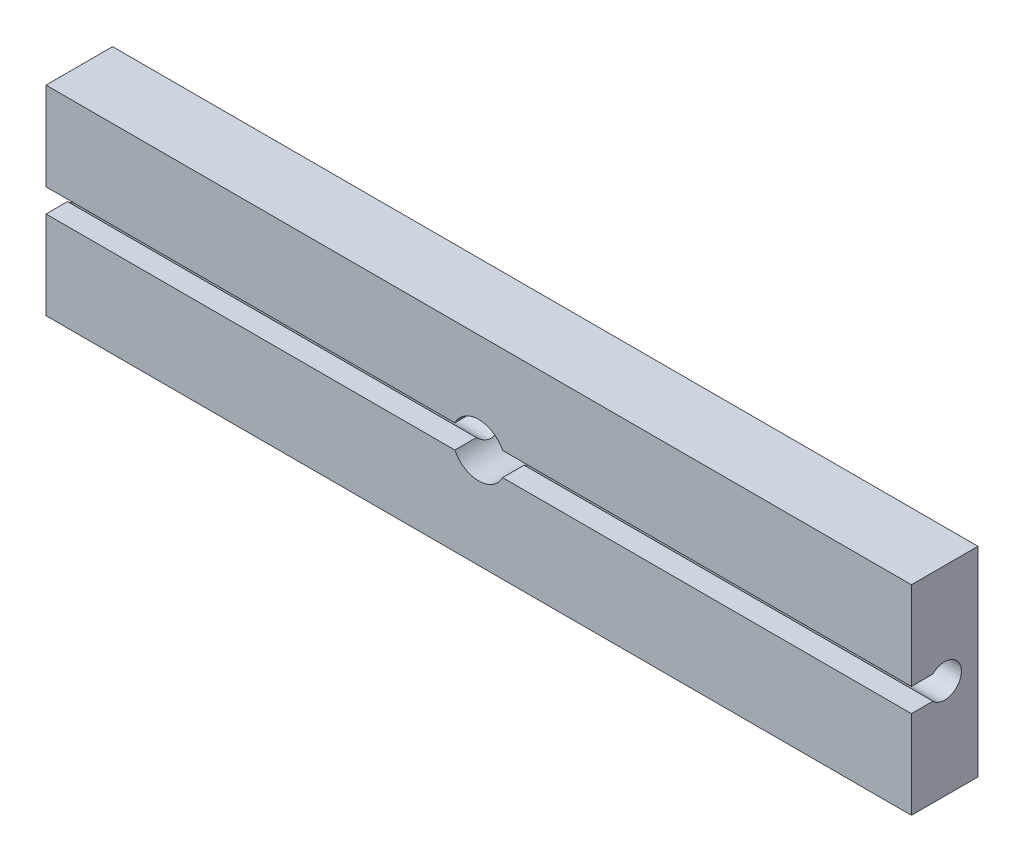
ISO-10303-21;
HEADER;
FILE_DESCRIPTION(('STEP AP214'),'2;1');
FILE_NAME('part.step','',(''),(''),'','','');
FILE_SCHEMA(('AUTOMOTIVE_DESIGN { 1 0 10303 214 1 1 1 1 }'));
ENDSEC;
DATA;
#1=APPLICATION_CONTEXT('core data for automotive mechanical design processes');
#2=APPLICATION_PROTOCOL_DEFINITION('international standard','automotive_design',2000,#1);
#3=PRODUCT_CONTEXT('',#1,'mechanical');
#4=PRODUCT('Part','Part','',(#3));
#5=PRODUCT_RELATED_PRODUCT_CATEGORY('part','',(#4));
#6=PRODUCT_DEFINITION_FORMATION('','',#4);
#7=PRODUCT_DEFINITION_CONTEXT('part definition',#1,'design');
#8=PRODUCT_DEFINITION('design','',#6,#7);
#9=PRODUCT_DEFINITION_SHAPE('','',#8);
#10=(LENGTH_UNIT() NAMED_UNIT(*) SI_UNIT(.MILLI.,.METRE.));
#11=(NAMED_UNIT(*) PLANE_ANGLE_UNIT() SI_UNIT($,.RADIAN.));
#12=(NAMED_UNIT(*) SI_UNIT($,.STERADIAN.) SOLID_ANGLE_UNIT());
#13=UNCERTAINTY_MEASURE_WITH_UNIT(LENGTH_MEASURE(1.E-05),#10,'distance_accuracy_value','');
#14=(GEOMETRIC_REPRESENTATION_CONTEXT(3) GLOBAL_UNCERTAINTY_ASSIGNED_CONTEXT((#13)) GLOBAL_UNIT_ASSIGNED_CONTEXT((#10,
#11,#12)) REPRESENTATION_CONTEXT('',''));
#15=CARTESIAN_POINT('',(0.,0.,0.));
#16=DIRECTION('',(0.,0.,1.));
#17=DIRECTION('',(1.,0.,0.));
#18=AXIS2_PLACEMENT_3D('',#15,#16,#17);
#19=CARTESIAN_POINT('',(65.,0.,4.99999999999773));
#20=DIRECTION('',(-1.,0.,0.));
#21=DIRECTION('',(0.,0.,1.));
#22=AXIS2_PLACEMENT_3D('',#19,#20,#21);
#23=CYLINDRICAL_SURFACE('',#22,2.5);
#24=DIRECTION('',(-1.,0.,0.));
#25=VECTOR('',#24,1.);
#26=CARTESIAN_POINT('',(65.,1.76776695296637,6.76776695296409));
#27=LINE('',#26,#25);
#28=CARTESIAN_POINT('',(65.,1.76776695296637,6.76776695296409));
#29=VERTEX_POINT('',#28);
#30=CARTESIAN_POINT('',(3.58817502360183,1.76776695296637,6.76776695296409));
#31=VERTEX_POINT('',#30);
#32=EDGE_CURVE('E65',#29,#31,#27,.T.);
#33=ORIENTED_EDGE('',*,*,#32,.T.);
#34=CARTESIAN_POINT('',(4.,0.,7.49999999999773));
#35=CARTESIAN_POINT('',(3.99999041333571,0.127017476559871,7.49998952385412));
#36=CARTESIAN_POINT('',(3.9938860659399,0.254191951791703,7.49025350009605));
#37=CARTESIAN_POINT('',(3.97004375552586,0.504637456621344,7.45182887031345));
#38=CARTESIAN_POINT('',(3.95228361873137,0.627900575825985,7.42310413973652));
#39=CARTESIAN_POINT('',(3.90691695293563,0.866410868269162,7.34837714671019));
#40=CARTESIAN_POINT('',(3.87935918690877,0.98169442070943,7.30246039021016));
#41=CARTESIAN_POINT('',(3.81669199838277,1.20252080434994,7.19522833250625));
#42=CARTESIAN_POINT('',(3.7815834126609,1.30806471304098,7.1339147374446));
#43=CARTESIAN_POINT('',(3.70340304945466,1.51594836437078,6.99222684340663));
#44=CARTESIAN_POINT('',(3.65991924217889,1.61735911616791,6.91072139729597));
#45=CARTESIAN_POINT('',(3.57062700058922,1.80597275567284,6.73356165373921));
#46=CARTESIAN_POINT('',(3.52481549782957,1.89315621594405,6.6378883442588));
#47=CARTESIAN_POINT('',(3.42860837235627,2.06285746302521,6.41993221070652));
#48=CARTESIAN_POINT('',(3.37843221966147,2.14314412018317,6.29580042656678));
#49=CARTESIAN_POINT('',(3.28660396278105,2.28147932079995,6.03287036931938));
#50=CARTESIAN_POINT('',(3.2449375200046,2.33956541787438,5.89409737482975));
#51=CARTESIAN_POINT('',(3.18619151248815,2.41866801180576,5.64237895245201));
#52=CARTESIAN_POINT('',(3.16553811970886,2.44539104794679,5.53206636307941));
#53=CARTESIAN_POINT('',(3.1356271466086,2.4836368711914,5.30738814861704));
#54=CARTESIAN_POINT('',(3.12635347378456,2.49518112485638,5.19302848282452));
#55=CARTESIAN_POINT('',(3.12059771534501,2.50237836690497,4.96317396712136));
#56=CARTESIAN_POINT('',(3.12414917427958,2.49798968200884,4.84767692941977));
#57=CARTESIAN_POINT('',(3.14354804883411,2.47352633347829,4.61937979127109));
#58=CARTESIAN_POINT('',(3.15940531965489,2.45343909745149,4.5065819271478));
#59=CARTESIAN_POINT('',(3.20065145822146,2.3993620946426,4.28912310325414));
#60=CARTESIAN_POINT('',(3.22581428653571,2.36570043522604,4.18433512028036));
#61=CARTESIAN_POINT('',(3.28291134443418,2.28580369589507,3.98167760352452));
#62=CARTESIAN_POINT('',(3.31484796808522,2.2395641689404,3.88381053215427));
#63=CARTESIAN_POINT('',(3.38909625095658,2.12589830407261,3.67833359248757));
#64=CARTESIAN_POINT('',(3.4322315520855,2.05612773657747,3.57231894814535));
#65=CARTESIAN_POINT('',(3.52011451554715,1.90176111958637,3.37233887302133));
#66=CARTESIAN_POINT('',(3.56486379714022,1.81714983251341,3.27838599995259));
#67=CARTESIAN_POINT('',(3.65959667460596,1.61904732877734,3.08939899041512));
#68=CARTESIAN_POINT('',(3.70922571443728,1.50309447420017,2.99674405727613));
#69=CARTESIAN_POINT('',(3.8005660184067,1.25426444468515,2.83228820636671));
#70=CARTESIAN_POINT('',(3.84228039228673,1.12139395127005,2.76047909218824));
#71=CARTESIAN_POINT('',(3.89435975869902,0.915775751567444,2.67265404336275));
#72=CARTESIAN_POINT('',(3.90966874385268,0.848193583187395,2.64716571356733));
#73=CARTESIAN_POINT('',(3.93701839875445,0.710492049478447,2.60199234951909));
#74=CARTESIAN_POINT('',(3.94906095588034,0.640374175967901,2.58230396342691));
#75=CARTESIAN_POINT('',(3.96949699527849,0.498239019538475,2.54906583835534));
#76=CARTESIAN_POINT('',(3.97789374843884,0.426223500915278,2.53551059647173));
#77=CARTESIAN_POINT('',(3.99078766491331,0.280965673560735,2.51475370668416));
#78=CARTESIAN_POINT('',(3.99528549435853,0.207723576570754,2.50755097345042));
#79=CARTESIAN_POINT('',(4.00193773474167,0.00911917689680919,2.49689069535418));
#80=CARTESIAN_POINT('',(4.000238122366,-0.116782016705691,2.49959963687421));
#81=CARTESIAN_POINT('',(3.98518313408306,-0.365967766011663,2.52375966446317));
#82=CARTESIAN_POINT('',(3.97182855210102,-0.489252499359946,2.54520947392245));
#83=CARTESIAN_POINT('',(3.93547975555369,-0.725036194002598,2.60447858798051));
#84=CARTESIAN_POINT('',(3.91288306371127,-0.837768421062909,2.64162472076751));
#85=CARTESIAN_POINT('',(3.85991402897874,-1.05527816125331,2.73059237131016));
#86=CARTESIAN_POINT('',(3.82954038411642,-1.16005433861599,2.78241634649916));
#87=CARTESIAN_POINT('',(3.75980014020658,-1.37016761969194,2.90503053750555));
#88=CARTESIAN_POINT('',(3.71983526755373,-1.47449380296905,2.97720717227275));
#89=CARTESIAN_POINT('',(3.63613942885727,-1.67028541330073,3.13558769646702));
#90=CARTESIAN_POINT('',(3.59240430473134,-1.76173634038025,3.22180716888341));
#91=CARTESIAN_POINT('',(3.49811738486729,-1.94294835276253,3.42027008984338));
#92=CARTESIAN_POINT('',(3.44749766579192,-2.03053702733637,3.53447441549525));
#93=CARTESIAN_POINT('',(3.35133525746893,-2.18560704916439,3.7777515669803));
#94=CARTESIAN_POINT('',(3.30578906708369,-2.25310231693768,3.90681401288904));
#95=CARTESIAN_POINT('',(3.23467060578839,-2.35369543821018,4.1493842965973));
#96=CARTESIAN_POINT('',(3.20691272363805,-2.39103791720685,4.26048150138643));
#97=CARTESIAN_POINT('',(3.16210061351252,-2.45000216420748,4.48878629161117));
#98=CARTESIAN_POINT('',(3.1450296652982,-2.47164849805251,4.60598401968715));
#99=CARTESIAN_POINT('',(3.124126499326,-2.49802767469226,4.84418055296812));
#100=CARTESIAN_POINT('',(3.12037003193165,-2.50266374586469,4.96519716787766));
#101=CARTESIAN_POINT('',(3.12698126375719,-2.49439556773532,5.20626192382724));
#102=CARTESIAN_POINT('',(3.13735365770479,-2.48148548821457,5.32630972961708));
#103=CARTESIAN_POINT('',(3.16910777009989,-2.44076547086105,5.55205957943383));
#104=CARTESIAN_POINT('',(3.18953614189074,-2.41423847191721,5.6581385645001));
#105=CARTESIAN_POINT('',(3.23835062785226,-2.34835238743426,5.86427015751598));
#106=CARTESIAN_POINT('',(3.26674005971309,-2.30898795090781,5.964320231815));
#107=CARTESIAN_POINT('',(3.33327797617852,-2.21205415803959,6.17119332433586));
#108=CARTESIAN_POINT('',(3.3722442852408,-2.15267427981667,6.27689994626147));
#109=CARTESIAN_POINT('',(3.45335445323995,-2.01999894889208,6.47787738570698));
#110=CARTESIAN_POINT('',(3.49550086438999,-1.94669224594686,6.57313966737181));
#111=CARTESIAN_POINT('',(3.58803675426846,-1.77134669685941,6.77002558379615));
#112=CARTESIAN_POINT('',(3.63840488260278,-1.66649284489893,6.86916976153701));
#113=CARTESIAN_POINT('',(3.7339805383823,-1.43961937990849,7.04900159612278));
#114=CARTESIAN_POINT('',(3.77918486147258,-1.3175892119665,7.12967782367524));
#115=CARTESIAN_POINT('',(3.83959214728415,-1.12346357942551,7.23456343855648));
#116=CARTESIAN_POINT('',(3.85851834157057,-1.05679601158095,7.26687480004472));
#117=CARTESIAN_POINT('',(3.89335165397882,-0.920199584374065,7.32567225182152));
#118=CARTESIAN_POINT('',(3.9092605122592,-0.850272633931988,7.35216170113282));
#119=CARTESIAN_POINT('',(3.93753374175517,-0.70787368843777,7.39885714445989));
#120=CARTESIAN_POINT('',(3.94990764965183,-0.635409144572268,7.41908005724339));
#121=CARTESIAN_POINT('',(3.97075677458059,-0.488456989557118,7.4529754555801));
#122=CARTESIAN_POINT('',(3.97923486692924,-0.41397091354553,7.46665277243721));
#123=CARTESIAN_POINT('',(3.99038271291772,-0.282852605094051,7.48459041022446));
#124=CARTESIAN_POINT('',(3.99398159517595,-0.226501515914868,7.4903615302499));
#125=CARTESIAN_POINT('',(3.99879245372932,-0.113444074519046,7.49806878362488));
#126=CARTESIAN_POINT('',(4.00000428228699,-0.0567377005313049,7.50000467960809));
#127=CARTESIAN_POINT('',(4.,0.,7.49999999999773));
#128=B_SPLINE_CURVE_WITH_KNOTS('',3,(#34,#35,#36,#37,#38,#39,#40,#41,#42,#43,#44,#45,#46,#47,
#48,#49,#50,#51,#52,#53,#54,#55,#56,#57,#58,#59,#60,#61,#62,#63,#64,#65,#66,#67,#68,#69,#70,#71,
#72,#73,#74,#75,#76,#77,#78,#79,#80,#81,#82,#83,#84,#85,#86,#87,#88,#89,#90,#91,#92,#93,#94,#95,
#96,#97,#98,#99,#100,#101,#102,#103,#104,#105,#106,#107,#108,#109,#110,#111,#112,#113,#114,#115,
#116,#117,#118,#119,#120,#121,#122,#123,#124,#125,#126,#127),.UNSPECIFIED.,.T.,.F.,(4,2,2,2,2,2,
2,2,2,2,2,2,2,2,2,2,2,2,2,2,2,2,2,2,2,2,2,2,2,2,2,2,2,2,2,2,2,2,2,2,2,2,2,2,2,2,4),(0.,
0.380824602868265,0.762375788256924,1.14205397519027,1.52169010807759,1.93164374107244,
2.34215256651403,2.80825951705947,3.27357449214021,3.61824017759434,3.96241789414782,
4.30749646997556,4.65285169010166,4.99031678920873,5.32790135816066,5.72854900708719,
6.12961045150363,6.59684361399043,7.06389281455722,7.28510978359955,7.50619865744383,
7.72708876613707,7.94794112831293,8.32363778110177,8.69930884379593,9.06028425977629,
9.42132014771965,9.81879878896137,10.216721545704,10.6724083464246,11.1277787130885,
11.4876929754247,11.8470427174174,12.2084336629143,12.5699447204276,12.9023575499051,
13.2349091154192,13.6156046298899,13.9966089922257,14.4531049498526,14.9098826607203,
15.138984863948,15.3679545348469,15.5963005225022,15.8244777070605,15.994578512822,
16.1646898459841),.UNSPECIFIED.);
#129=CARTESIAN_POINT('',(3.58817502360183,-1.76776695296636,6.7677669529641));
#130=VERTEX_POINT('',#129);
#131=EDGE_CURVE('E145',#31,#130,#128,.T.);
#132=ORIENTED_EDGE('',*,*,#131,.T.);
#133=DIRECTION('',(-1.,0.,0.));
#134=VECTOR('',#133,1.);
#135=CARTESIAN_POINT('',(65.,-1.76776695296636,6.7677669529641));
#136=LINE('',#135,#134);
#137=CARTESIAN_POINT('',(65.,-1.76776695296636,6.7677669529641));
#138=VERTEX_POINT('',#137);
#139=EDGE_CURVE('E131',#138,#130,#136,.T.);
#140=ORIENTED_EDGE('',*,*,#139,.F.);
#141=CARTESIAN_POINT('',(65.,0.,4.99999999999773));
#142=DIRECTION('',(-1.,0.,0.));
#143=DIRECTION('',(0.,0.,1.));
#144=AXIS2_PLACEMENT_3D('',#141,#142,#143);
#145=CIRCLE('',#144,2.5);
#146=EDGE_CURVE('E143',#29,#138,#145,.T.);
#147=ORIENTED_EDGE('',*,*,#146,.F.);
#148=EDGE_LOOP('',(#33,#132,#140,#147));
#149=FACE_BOUND('',#148,.T.);
#150=ADVANCED_FACE('F40',(#149),#23,.F.);
#151=CARTESIAN_POINT('',(-3.58817502360183,1.76776695296637,6.76776695296409));
#152=VERTEX_POINT('',#151);
#153=CARTESIAN_POINT('',(-65.,1.76776695296637,6.76776695296409));
#154=VERTEX_POINT('',#153);
#155=EDGE_CURVE('E239',#152,#154,#27,.T.);
#156=ORIENTED_EDGE('',*,*,#155,.T.);
#157=CARTESIAN_POINT('',(-65.,0.,4.99999999999773));
#158=DIRECTION('',(-1.,0.,0.));
#159=DIRECTION('',(0.,0.,1.));
#160=AXIS2_PLACEMENT_3D('',#157,#158,#159);
#161=CIRCLE('',#160,2.5);
#162=CARTESIAN_POINT('',(-65.,-1.76776695296636,6.7677669529641));
#163=VERTEX_POINT('',#162);
#164=EDGE_CURVE('E152',#154,#163,#161,.T.);
#165=ORIENTED_EDGE('',*,*,#164,.T.);
#166=CARTESIAN_POINT('',(-3.58817502360184,-1.76776695296636,6.7677669529641));
#167=VERTEX_POINT('',#166);
#168=EDGE_CURVE('E147',#167,#163,#136,.T.);
#169=ORIENTED_EDGE('',*,*,#168,.F.);
#170=CARTESIAN_POINT('',(-4.,0.,7.49999999999773));
#171=CARTESIAN_POINT('',(-3.99999041333571,-0.127017476559871,7.49998952385412));
#172=CARTESIAN_POINT('',(-3.9938860659399,-0.254191951791703,7.49025350009605));
#173=CARTESIAN_POINT('',(-3.97004375552586,-0.504637456621344,7.45182887031345));
#174=CARTESIAN_POINT('',(-3.95228361873137,-0.627900575825985,7.42310413973652));
#175=CARTESIAN_POINT('',(-3.90691695293563,-0.866410868269162,7.34837714671019));
#176=CARTESIAN_POINT('',(-3.87935918690877,-0.98169442070943,7.30246039021016));
#177=CARTESIAN_POINT('',(-3.81669199838277,-1.20252080434994,7.19522833250625));
#178=CARTESIAN_POINT('',(-3.7815834126609,-1.30806471304098,7.1339147374446));
#179=CARTESIAN_POINT('',(-3.70340304945466,-1.51594836437078,6.99222684340663));
#180=CARTESIAN_POINT('',(-3.65991924217889,-1.61735911616791,6.91072139729597));
#181=CARTESIAN_POINT('',(-3.57062700058922,-1.80597275567284,6.73356165373921));
#182=CARTESIAN_POINT('',(-3.52481549782957,-1.89315621594405,6.6378883442588));
#183=CARTESIAN_POINT('',(-3.42860837235627,-2.06285746302521,6.41993221070652));
#184=CARTESIAN_POINT('',(-3.37843221966147,-2.14314412018317,6.29580042656678));
#185=CARTESIAN_POINT('',(-3.28660396278105,-2.28147932079995,6.03287036931938));
#186=CARTESIAN_POINT('',(-3.2449375200046,-2.33956541787438,5.89409737482975));
#187=CARTESIAN_POINT('',(-3.18619151248815,-2.41866801180576,5.64237895245201));
#188=CARTESIAN_POINT('',(-3.16553811970886,-2.44539104794679,5.53206636307941));
#189=CARTESIAN_POINT('',(-3.1356271466086,-2.4836368711914,5.30738814861704));
#190=CARTESIAN_POINT('',(-3.12635347378456,-2.49518112485638,5.19302848282452));
#191=CARTESIAN_POINT('',(-3.12059771534501,-2.50237836690497,4.96317396712136));
#192=CARTESIAN_POINT('',(-3.12414917427958,-2.49798968200884,4.84767692941977));
#193=CARTESIAN_POINT('',(-3.14354804883411,-2.47352633347829,4.61937979127109));
#194=CARTESIAN_POINT('',(-3.15940531965489,-2.45343909745149,4.5065819271478));
#195=CARTESIAN_POINT('',(-3.20065145822146,-2.3993620946426,4.28912310325414));
#196=CARTESIAN_POINT('',(-3.22581428653571,-2.36570043522604,4.18433512028036));
#197=CARTESIAN_POINT('',(-3.28291134443418,-2.28580369589507,3.98167760352452));
#198=CARTESIAN_POINT('',(-3.31484796808522,-2.2395641689404,3.88381053215427));
#199=CARTESIAN_POINT('',(-3.38909625095658,-2.12589830407261,3.67833359248757));
#200=CARTESIAN_POINT('',(-3.4322315520855,-2.05612773657747,3.57231894814535));
#201=CARTESIAN_POINT('',(-3.52011451554715,-1.90176111958637,3.37233887302133));
#202=CARTESIAN_POINT('',(-3.56486379714022,-1.81714983251341,3.27838599995259));
#203=CARTESIAN_POINT('',(-3.65959667460596,-1.61904732877734,3.08939899041512));
#204=CARTESIAN_POINT('',(-3.70922571443728,-1.50309447420017,2.99674405727613));
#205=CARTESIAN_POINT('',(-3.8005660184067,-1.25426444468515,2.83228820636671));
#206=CARTESIAN_POINT('',(-3.84228039228673,-1.12139395127005,2.76047909218824));
#207=CARTESIAN_POINT('',(-3.89435975869902,-0.915775751567444,2.67265404336275));
#208=CARTESIAN_POINT('',(-3.90966874385268,-0.848193583187395,2.64716571356733));
#209=CARTESIAN_POINT('',(-3.93701839875445,-0.710492049478447,2.60199234951909));
#210=CARTESIAN_POINT('',(-3.94906095588034,-0.640374175967901,2.58230396342691));
#211=CARTESIAN_POINT('',(-3.96949699527849,-0.498239019538475,2.54906583835534));
#212=CARTESIAN_POINT('',(-3.97789374843884,-0.426223500915278,2.53551059647173));
#213=CARTESIAN_POINT('',(-3.99078766491331,-0.280965673560735,2.51475370668416));
#214=CARTESIAN_POINT('',(-3.99528549435853,-0.207723576570754,2.50755097345042));
#215=CARTESIAN_POINT('',(-4.00193773474167,-0.00911917689680919,2.49689069535418));
#216=CARTESIAN_POINT('',(-4.000238122366,0.116782016705691,2.49959963687421));
#217=CARTESIAN_POINT('',(-3.98518313408306,0.365967766011663,2.52375966446317));
#218=CARTESIAN_POINT('',(-3.97182855210102,0.489252499359946,2.54520947392245));
#219=CARTESIAN_POINT('',(-3.93547975555369,0.725036194002598,2.60447858798051));
#220=CARTESIAN_POINT('',(-3.91288306371127,0.837768421062909,2.64162472076751));
#221=CARTESIAN_POINT('',(-3.85991402897874,1.05527816125331,2.73059237131016));
#222=CARTESIAN_POINT('',(-3.82954038411642,1.16005433861599,2.78241634649916));
#223=CARTESIAN_POINT('',(-3.75980014020658,1.37016761969194,2.90503053750555));
#224=CARTESIAN_POINT('',(-3.71983526755373,1.47449380296905,2.97720717227275));
#225=CARTESIAN_POINT('',(-3.63613942885727,1.67028541330073,3.13558769646702));
#226=CARTESIAN_POINT('',(-3.59240430473134,1.76173634038025,3.22180716888341));
#227=CARTESIAN_POINT('',(-3.49811738486729,1.94294835276253,3.42027008984338));
#228=CARTESIAN_POINT('',(-3.44749766579192,2.03053702733637,3.53447441549525));
#229=CARTESIAN_POINT('',(-3.35133525746893,2.18560704916439,3.7777515669803));
#230=CARTESIAN_POINT('',(-3.30578906708369,2.25310231693768,3.90681401288904));
#231=CARTESIAN_POINT('',(-3.23467060578839,2.35369543821018,4.1493842965973));
#232=CARTESIAN_POINT('',(-3.20691272363805,2.39103791720685,4.26048150138643));
#233=CARTESIAN_POINT('',(-3.16210061351252,2.45000216420748,4.48878629161117));
#234=CARTESIAN_POINT('',(-3.1450296652982,2.47164849805251,4.60598401968715));
#235=CARTESIAN_POINT('',(-3.124126499326,2.49802767469226,4.84418055296812));
#236=CARTESIAN_POINT('',(-3.12037003193165,2.50266374586469,4.96519716787766));
#237=CARTESIAN_POINT('',(-3.12698126375719,2.49439556773532,5.20626192382724));
#238=CARTESIAN_POINT('',(-3.13735365770479,2.48148548821457,5.32630972961708));
#239=CARTESIAN_POINT('',(-3.16910777009989,2.44076547086105,5.55205957943383));
#240=CARTESIAN_POINT('',(-3.18953614189074,2.41423847191721,5.6581385645001));
#241=CARTESIAN_POINT('',(-3.23835062785226,2.34835238743426,5.86427015751598));
#242=CARTESIAN_POINT('',(-3.26674005971309,2.30898795090781,5.964320231815));
#243=CARTESIAN_POINT('',(-3.33327797617852,2.21205415803959,6.17119332433586));
#244=CARTESIAN_POINT('',(-3.3722442852408,2.15267427981667,6.27689994626147));
#245=CARTESIAN_POINT('',(-3.45335445323995,2.01999894889208,6.47787738570698));
#246=CARTESIAN_POINT('',(-3.49550086438999,1.94669224594686,6.57313966737181));
#247=CARTESIAN_POINT('',(-3.58803675426846,1.77134669685941,6.77002558379615));
#248=CARTESIAN_POINT('',(-3.63840488260278,1.66649284489893,6.86916976153701));
#249=CARTESIAN_POINT('',(-3.7339805383823,1.43961937990849,7.04900159612278));
#250=CARTESIAN_POINT('',(-3.77918486147258,1.3175892119665,7.12967782367524));
#251=CARTESIAN_POINT('',(-3.83959214728415,1.12346357942551,7.23456343855648));
#252=CARTESIAN_POINT('',(-3.85851834157057,1.05679601158095,7.26687480004472));
#253=CARTESIAN_POINT('',(-3.89335165397882,0.920199584374065,7.32567225182152));
#254=CARTESIAN_POINT('',(-3.9092605122592,0.850272633931988,7.35216170113282));
#255=CARTESIAN_POINT('',(-3.93753374175517,0.70787368843777,7.39885714445989));
#256=CARTESIAN_POINT('',(-3.94990764965183,0.635409144572268,7.41908005724339));
#257=CARTESIAN_POINT('',(-3.97075677458059,0.488456989557118,7.4529754555801));
#258=CARTESIAN_POINT('',(-3.97923486692924,0.41397091354553,7.46665277243721));
#259=CARTESIAN_POINT('',(-3.99038271291772,0.282852605094051,7.48459041022446));
#260=CARTESIAN_POINT('',(-3.99398159517595,0.226501515914868,7.4903615302499));
#261=CARTESIAN_POINT('',(-3.99879245372932,0.113444074519046,7.49806878362488));
#262=CARTESIAN_POINT('',(-4.00000428228699,0.0567377005313049,7.50000467960809));
#263=CARTESIAN_POINT('',(-4.,0.,7.49999999999773));
#264=B_SPLINE_CURVE_WITH_KNOTS('',3,(#170,#171,#172,#173,#174,#175,#176,#177,#178,#179,#180,
#181,#182,#183,#184,#185,#186,#187,#188,#189,#190,#191,#192,#193,#194,#195,#196,#197,#198,#199,
#200,#201,#202,#203,#204,#205,#206,#207,#208,#209,#210,#211,#212,#213,#214,#215,#216,#217,#218,
#219,#220,#221,#222,#223,#224,#225,#226,#227,#228,#229,#230,#231,#232,#233,#234,#235,#236,#237,
#238,#239,#240,#241,#242,#243,#244,#245,#246,#247,#248,#249,#250,#251,#252,#253,#254,#255,#256,
#257,#258,#259,#260,#261,#262,#263),.UNSPECIFIED.,.T.,.F.,(4,2,2,2,2,2,2,2,2,2,2,2,2,2,2,2,2,2,
2,2,2,2,2,2,2,2,2,2,2,2,2,2,2,2,2,2,2,2,2,2,2,2,2,2,2,2,4),(0.,0.380824602868265,
0.762375788256924,1.14205397519027,1.52169010807759,1.93164374107244,2.34215256651403,
2.80825951705947,3.27357449214021,3.61824017759434,3.96241789414782,4.30749646997556,
4.65285169010166,4.99031678920873,5.32790135816066,5.72854900708719,6.12961045150363,
6.59684361399043,7.06389281455722,7.28510978359955,7.50619865744383,7.72708876613707,
7.94794112831293,8.32363778110177,8.69930884379593,9.06028425977629,9.42132014771965,
9.81879878896137,10.216721545704,10.6724083464246,11.1277787130885,11.4876929754247,
11.8470427174174,12.2084336629143,12.5699447204276,12.9023575499051,13.2349091154192,
13.6156046298899,13.9966089922257,14.4531049498526,14.9098826607203,15.138984863948,
15.3679545348469,15.5963005225022,15.8244777070605,15.994578512822,16.1646898459841),.UNSPECIFIED.);
#265=EDGE_CURVE('E187',#167,#152,#264,.T.);
#266=ORIENTED_EDGE('',*,*,#265,.T.);
#267=EDGE_LOOP('',(#156,#165,#169,#266));
#268=FACE_BOUND('',#267,.T.);
#269=ADVANCED_FACE('F229',(#268),#23,.F.);
#270=CARTESIAN_POINT('',(0.,0.,10.));
#271=DIRECTION('',(0.,0.,1.));
#272=DIRECTION('',(1.,0.,0.));
#273=AXIS2_PLACEMENT_3D('',#270,#271,#272);
#274=PLANE('',#273);
#275=DIRECTION('',(0.,-1.,0.));
#276=VECTOR('',#275,1.);
#277=CARTESIAN_POINT('',(-65.,15.,10.));
#278=LINE('',#277,#276);
#279=CARTESIAN_POINT('',(-65.,15.,10.));
#280=VERTEX_POINT('',#279);
#281=CARTESIAN_POINT('',(-65.,1.76776695296637,10.));
#282=VERTEX_POINT('',#281);
#283=EDGE_CURVE('E166',#280,#282,#278,.T.);
#284=ORIENTED_EDGE('',*,*,#283,.T.);
#285=DIRECTION('',(-1.,0.,0.));
#286=VECTOR('',#285,1.);
#287=CARTESIAN_POINT('',(65.,1.76776695296637,10.));
#288=LINE('',#287,#286);
#289=CARTESIAN_POINT('',(-3.58817502360183,1.76776695296637,10.));
#290=VERTEX_POINT('',#289);
#291=EDGE_CURVE('E259',#290,#282,#288,.T.);
#292=ORIENTED_EDGE('',*,*,#291,.F.);
#293=CARTESIAN_POINT('',(0.,0.,10.));
#294=DIRECTION('',(0.,0.,1.));
#295=DIRECTION('',(1.,0.,0.));
#296=AXIS2_PLACEMENT_3D('',#293,#294,#295);
#297=CIRCLE('',#296,4.);
#298=CARTESIAN_POINT('',(3.58817502360183,1.76776695296637,10.));
#299=VERTEX_POINT('',#298);
#300=EDGE_CURVE('E188',#299,#290,#297,.T.);
#301=ORIENTED_EDGE('',*,*,#300,.F.);
#302=CARTESIAN_POINT('',(65.,1.76776695296637,10.));
#303=VERTEX_POINT('',#302);
#304=EDGE_CURVE('E244',#303,#299,#288,.T.);
#305=ORIENTED_EDGE('',*,*,#304,.F.);
#306=DIRECTION('',(0.,1.,0.));
#307=VECTOR('',#306,1.);
#308=CARTESIAN_POINT('',(65.,15.,10.));
#309=LINE('',#308,#307);
#310=CARTESIAN_POINT('',(65.,15.,10.));
#311=VERTEX_POINT('',#310);
#312=EDGE_CURVE('E169',#303,#311,#309,.T.);
#313=ORIENTED_EDGE('',*,*,#312,.T.);
#314=DIRECTION('',(1.,0.,0.));
#315=VECTOR('',#314,1.);
#316=CARTESIAN_POINT('',(0.,15.,10.));
#317=LINE('',#316,#315);
#318=EDGE_CURVE('E11',#280,#311,#317,.T.);
#319=ORIENTED_EDGE('',*,*,#318,.F.);
#320=EDGE_LOOP('',(#284,#292,#301,#305,#313,#319));
#321=FACE_BOUND('',#320,.T.);
#322=ADVANCED_FACE('F208',(#321),#274,.T.);
#323=CARTESIAN_POINT('',(0.,0.,0.));
#324=DIRECTION('',(0.,0.,1.));
#325=DIRECTION('',(1.,0.,0.));
#326=AXIS2_PLACEMENT_3D('',#323,#324,#325);
#327=CYLINDRICAL_SURFACE('',#326,4.);
#328=CARTESIAN_POINT('',(0.,0.,0.));
#329=DIRECTION('',(0.,0.,1.));
#330=DIRECTION('',(1.,0.,0.));
#331=AXIS2_PLACEMENT_3D('',#328,#329,#330);
#332=CIRCLE('',#331,4.);
#333=CARTESIAN_POINT('',(4.,0.,0.));
#334=VERTEX_POINT('',#333);
#335=EDGE_CURVE('E184',#334,#334,#332,.T.);
#336=ORIENTED_EDGE('',*,*,#335,.F.);
#337=EDGE_LOOP('',(#336));
#338=FACE_BOUND('',#337,.T.);
#339=DIRECTION('',(0.,0.,1.));
#340=VECTOR('',#339,1.);
#341=CARTESIAN_POINT('',(3.58817502360183,1.76776695296637,0.));
#342=LINE('',#341,#340);
#343=EDGE_CURVE('E158',#299,#31,#342,.F.);
#344=ORIENTED_EDGE('',*,*,#343,.F.);
#345=ORIENTED_EDGE('',*,*,#300,.T.);
#346=DIRECTION('',(0.,0.,1.));
#347=VECTOR('',#346,1.);
#348=CARTESIAN_POINT('',(-3.58817502360183,1.76776695296637,0.));
#349=LINE('',#348,#347);
#350=EDGE_CURVE('E264',#152,#290,#349,.T.);
#351=ORIENTED_EDGE('',*,*,#350,.F.);
#352=ORIENTED_EDGE('',*,*,#265,.F.);
#353=DIRECTION('',(0.,0.,1.));
#354=VECTOR('',#353,1.);
#355=CARTESIAN_POINT('',(-3.58817502360183,-1.76776695296636,0.));
#356=LINE('',#355,#354);
#357=CARTESIAN_POINT('',(-3.58817502360184,-1.76776695296636,10.));
#358=VERTEX_POINT('',#357);
#359=EDGE_CURVE('E257',#167,#358,#356,.T.);
#360=ORIENTED_EDGE('',*,*,#359,.T.);
#361=CARTESIAN_POINT('',(3.58817502360183,-1.76776695296636,10.));
#362=VERTEX_POINT('',#361);
#363=EDGE_CURVE('E181',#358,#362,#297,.T.);
#364=ORIENTED_EDGE('',*,*,#363,.T.);
#365=DIRECTION('',(0.,0.,1.));
#366=VECTOR('',#365,1.);
#367=CARTESIAN_POINT('',(3.58817502360183,-1.76776695296636,0.));
#368=LINE('',#367,#366);
#369=EDGE_CURVE('E263',#362,#130,#368,.F.);
#370=ORIENTED_EDGE('',*,*,#369,.T.);
#371=ORIENTED_EDGE('',*,*,#131,.F.);
#372=EDGE_LOOP('',(#344,#345,#351,#352,#360,#364,#370,#371));
#373=FACE_BOUND('',#372,.T.);
#374=ADVANCED_FACE('F204',(#338,#373),#327,.F.);
#375=CARTESIAN_POINT('',(65.,15.,0.));
#376=DIRECTION('',(1.,0.,0.));
#377=DIRECTION('',(0.,0.,-1.));
#378=AXIS2_PLACEMENT_3D('',#375,#376,#377);
#379=PLANE('',#378);
#380=ORIENTED_EDGE('',*,*,#312,.F.);
#381=DIRECTION('',(0.,0.,1.));
#382=VECTOR('',#381,1.);
#383=CARTESIAN_POINT('',(65.,1.76776695296637,0.));
#384=LINE('',#383,#382);
#385=EDGE_CURVE('E137',#29,#303,#384,.T.);
#386=ORIENTED_EDGE('',*,*,#385,.F.);
#387=ORIENTED_EDGE('',*,*,#146,.T.);
#388=DIRECTION('',(0.,0.,1.));
#389=VECTOR('',#388,1.);
#390=CARTESIAN_POINT('',(65.,-1.76776695296636,0.));
#391=LINE('',#390,#389);
#392=CARTESIAN_POINT('',(65.,-1.76776695296636,10.));
#393=VERTEX_POINT('',#392);
#394=EDGE_CURVE('E128',#138,#393,#391,.T.);
#395=ORIENTED_EDGE('',*,*,#394,.T.);
#396=CARTESIAN_POINT('',(65.,-15.,10.));
#397=VERTEX_POINT('',#396);
#398=EDGE_CURVE('E176',#397,#393,#309,.T.);
#399=ORIENTED_EDGE('',*,*,#398,.F.);
#400=DIRECTION('',(0.,0.,1.));
#401=VECTOR('',#400,1.);
#402=CARTESIAN_POINT('',(65.,-15.,0.));
#403=LINE('',#402,#401);
#404=CARTESIAN_POINT('',(65.,-15.,0.));
#405=VERTEX_POINT('',#404);
#406=EDGE_CURVE('E175',#405,#397,#403,.T.);
#407=ORIENTED_EDGE('',*,*,#406,.F.);
#408=DIRECTION('',(0.,1.,0.));
#409=VECTOR('',#408,1.);
#410=CARTESIAN_POINT('',(65.,15.,0.));
#411=LINE('',#410,#409);
#412=CARTESIAN_POINT('',(65.,15.,0.));
#413=VERTEX_POINT('',#412);
#414=EDGE_CURVE('E173',#405,#413,#411,.T.);
#415=ORIENTED_EDGE('',*,*,#414,.T.);
#416=DIRECTION('',(0.,0.,1.));
#417=VECTOR('',#416,1.);
#418=CARTESIAN_POINT('',(65.,15.,0.));
#419=LINE('',#418,#417);
#420=EDGE_CURVE('E178',#413,#311,#419,.T.);
#421=ORIENTED_EDGE('',*,*,#420,.T.);
#422=EDGE_LOOP('',(#380,#386,#387,#395,#399,#407,#415,#421));
#423=FACE_BOUND('',#422,.T.);
#424=ADVANCED_FACE('F150',(#423),#379,.T.);
#425=CARTESIAN_POINT('',(-65.,15.,0.));
#426=DIRECTION('',(-1.,0.,0.));
#427=DIRECTION('',(0.,0.,1.));
#428=AXIS2_PLACEMENT_3D('',#425,#426,#427);
#429=PLANE('',#428);
#430=ORIENTED_EDGE('',*,*,#164,.F.);
#431=DIRECTION('',(0.,0.,1.));
#432=VECTOR('',#431,1.);
#433=CARTESIAN_POINT('',(-65.,1.76776695296637,0.));
#434=LINE('',#433,#432);
#435=EDGE_CURVE('E138',#154,#282,#434,.T.);
#436=ORIENTED_EDGE('',*,*,#435,.T.);
#437=ORIENTED_EDGE('',*,*,#283,.F.);
#438=DIRECTION('',(0.,0.,1.));
#439=VECTOR('',#438,1.);
#440=CARTESIAN_POINT('',(-65.,15.,0.));
#441=LINE('',#440,#439);
#442=CARTESIAN_POINT('',(-65.,15.,0.));
#443=VERTEX_POINT('',#442);
#444=EDGE_CURVE('E155',#443,#280,#441,.T.);
#445=ORIENTED_EDGE('',*,*,#444,.F.);
#446=DIRECTION('',(0.,-1.,0.));
#447=VECTOR('',#446,1.);
#448=CARTESIAN_POINT('',(-65.,15.,0.));
#449=LINE('',#448,#447);
#450=CARTESIAN_POINT('',(-65.,-15.,0.));
#451=VERTEX_POINT('',#450);
#452=EDGE_CURVE('E164',#443,#451,#449,.T.);
#453=ORIENTED_EDGE('',*,*,#452,.T.);
#454=DIRECTION('',(0.,0.,1.));
#455=VECTOR('',#454,1.);
#456=CARTESIAN_POINT('',(-65.,-15.,0.));
#457=LINE('',#456,#455);
#458=CARTESIAN_POINT('',(-65.,-15.,10.));
#459=VERTEX_POINT('',#458);
#460=EDGE_CURVE('E151',#451,#459,#457,.T.);
#461=ORIENTED_EDGE('',*,*,#460,.T.);
#462=CARTESIAN_POINT('',(-65.,-1.76776695296636,10.));
#463=VERTEX_POINT('',#462);
#464=EDGE_CURVE('E170',#463,#459,#278,.T.);
#465=ORIENTED_EDGE('',*,*,#464,.F.);
#466=DIRECTION('',(0.,0.,1.));
#467=VECTOR('',#466,1.);
#468=CARTESIAN_POINT('',(-65.,-1.76776695296636,0.));
#469=LINE('',#468,#467);
#470=EDGE_CURVE('E250',#163,#463,#469,.T.);
#471=ORIENTED_EDGE('',*,*,#470,.F.);
#472=EDGE_LOOP('',(#430,#436,#437,#445,#453,#461,#465,#471));
#473=FACE_BOUND('',#472,.T.);
#474=ADVANCED_FACE('F213',(#473),#429,.T.);
#475=DIRECTION('',(-1.,0.,0.));
#476=VECTOR('',#475,1.);
#477=CARTESIAN_POINT('',(65.,-1.76776695296636,10.));
#478=LINE('',#477,#476);
#479=EDGE_CURVE('E146',#358,#463,#478,.T.);
#480=ORIENTED_EDGE('',*,*,#479,.T.);
#481=ORIENTED_EDGE('',*,*,#464,.T.);
#482=DIRECTION('',(1.,0.,0.));
#483=VECTOR('',#482,1.);
#484=CARTESIAN_POINT('',(0.,-15.,10.));
#485=LINE('',#484,#483);
#486=EDGE_CURVE('E49',#459,#397,#485,.T.);
#487=ORIENTED_EDGE('',*,*,#486,.T.);
#488=ORIENTED_EDGE('',*,*,#398,.T.);
#489=EDGE_CURVE('E57',#393,#362,#478,.T.);
#490=ORIENTED_EDGE('',*,*,#489,.T.);
#491=ORIENTED_EDGE('',*,*,#363,.F.);
#492=EDGE_LOOP('',(#480,#481,#487,#488,#490,#491));
#493=FACE_BOUND('',#492,.T.);
#494=ADVANCED_FACE('F216',(#493),#274,.T.);
#495=CARTESIAN_POINT('',(0.,0.,0.));
#496=DIRECTION('',(0.,0.,1.));
#497=DIRECTION('',(1.,0.,0.));
#498=AXIS2_PLACEMENT_3D('',#495,#496,#497);
#499=PLANE('',#498);
#500=ORIENTED_EDGE('',*,*,#335,.T.);
#501=EDGE_LOOP('',(#500));
#502=FACE_BOUND('',#501,.T.);
#503=DIRECTION('',(1.,0.,0.));
#504=VECTOR('',#503,1.);
#505=CARTESIAN_POINT('',(0.,-15.,0.));
#506=LINE('',#505,#504);
#507=EDGE_CURVE('E271',#451,#405,#506,.T.);
#508=ORIENTED_EDGE('',*,*,#507,.F.);
#509=ORIENTED_EDGE('',*,*,#452,.F.);
#510=DIRECTION('',(1.,0.,0.));
#511=VECTOR('',#510,1.);
#512=CARTESIAN_POINT('',(0.,15.,0.));
#513=LINE('',#512,#511);
#514=EDGE_CURVE('E44',#443,#413,#513,.T.);
#515=ORIENTED_EDGE('',*,*,#514,.T.);
#516=ORIENTED_EDGE('',*,*,#414,.F.);
#517=EDGE_LOOP('',(#508,#509,#515,#516));
#518=FACE_BOUND('',#517,.T.);
#519=ADVANCED_FACE('F280',(#502,#518),#499,.F.);
#520=CARTESIAN_POINT('',(0.,-15.,10.));
#521=DIRECTION('',(0.,1.,0.));
#522=DIRECTION('',(0.,0.,1.));
#523=AXIS2_PLACEMENT_3D('',#520,#521,#522);
#524=PLANE('',#523);
#525=ORIENTED_EDGE('',*,*,#507,.T.);
#526=ORIENTED_EDGE('',*,*,#406,.T.);
#527=ORIENTED_EDGE('',*,*,#486,.F.);
#528=ORIENTED_EDGE('',*,*,#460,.F.);
#529=EDGE_LOOP('',(#525,#526,#527,#528));
#530=FACE_BOUND('',#529,.T.);
#531=ADVANCED_FACE('F42',(#530),#524,.F.);
#532=CARTESIAN_POINT('',(0.,15.,10.));
#533=DIRECTION('',(0.,1.,0.));
#534=DIRECTION('',(0.,0.,1.));
#535=AXIS2_PLACEMENT_3D('',#532,#533,#534);
#536=PLANE('',#535);
#537=ORIENTED_EDGE('',*,*,#514,.F.);
#538=ORIENTED_EDGE('',*,*,#444,.T.);
#539=ORIENTED_EDGE('',*,*,#318,.T.);
#540=ORIENTED_EDGE('',*,*,#420,.F.);
#541=EDGE_LOOP('',(#537,#538,#539,#540));
#542=FACE_BOUND('',#541,.T.);
#543=ADVANCED_FACE('F285',(#542),#536,.T.);
#544=CARTESIAN_POINT('',(65.,-1.76776695296636,0.));
#545=DIRECTION('',(0.,-1.,0.));
#546=DIRECTION('',(0.,0.,-1.));
#547=AXIS2_PLACEMENT_3D('',#544,#545,#546);
#548=PLANE('',#547);
#549=ORIENTED_EDGE('',*,*,#168,.T.);
#550=ORIENTED_EDGE('',*,*,#470,.T.);
#551=ORIENTED_EDGE('',*,*,#479,.F.);
#552=ORIENTED_EDGE('',*,*,#359,.F.);
#553=EDGE_LOOP('',(#549,#550,#551,#552));
#554=FACE_BOUND('',#553,.T.);
#555=ADVANCED_FACE('F222',(#554),#548,.F.);
#556=CARTESIAN_POINT('',(65.,1.76776695296637,0.));
#557=DIRECTION('',(0.,-1.,0.));
#558=DIRECTION('',(0.,0.,-1.));
#559=AXIS2_PLACEMENT_3D('',#556,#557,#558);
#560=PLANE('',#559);
#561=ORIENTED_EDGE('',*,*,#350,.T.);
#562=ORIENTED_EDGE('',*,*,#291,.T.);
#563=ORIENTED_EDGE('',*,*,#435,.F.);
#564=ORIENTED_EDGE('',*,*,#155,.F.);
#565=EDGE_LOOP('',(#561,#562,#563,#564));
#566=FACE_BOUND('',#565,.T.);
#567=ADVANCED_FACE('F221',(#566),#560,.T.);
#568=ORIENTED_EDGE('',*,*,#489,.F.);
#569=ORIENTED_EDGE('',*,*,#394,.F.);
#570=ORIENTED_EDGE('',*,*,#139,.T.);
#571=ORIENTED_EDGE('',*,*,#369,.F.);
#572=EDGE_LOOP('',(#568,#569,#570,#571));
#573=FACE_BOUND('',#572,.T.);
#574=ADVANCED_FACE('F130',(#573),#548,.F.);
#575=ORIENTED_EDGE('',*,*,#343,.T.);
#576=ORIENTED_EDGE('',*,*,#32,.F.);
#577=ORIENTED_EDGE('',*,*,#385,.T.);
#578=ORIENTED_EDGE('',*,*,#304,.T.);
#579=EDGE_LOOP('',(#575,#576,#577,#578));
#580=FACE_BOUND('',#579,.T.);
#581=ADVANCED_FACE('F220',(#580),#560,.T.);
#582=CLOSED_SHELL('',(#150,#269,#322,#374,#424,#474,#494,#519,#531,#543,#555,#567,#574,#581));
#583=MANIFOLD_SOLID_BREP('B2',#582);
#584=ADVANCED_BREP_SHAPE_REPRESENTATION('',(#18,#583),#14);
#585=SHAPE_DEFINITION_REPRESENTATION(#9,#584);
ENDSEC;
END-ISO-10303-21;
